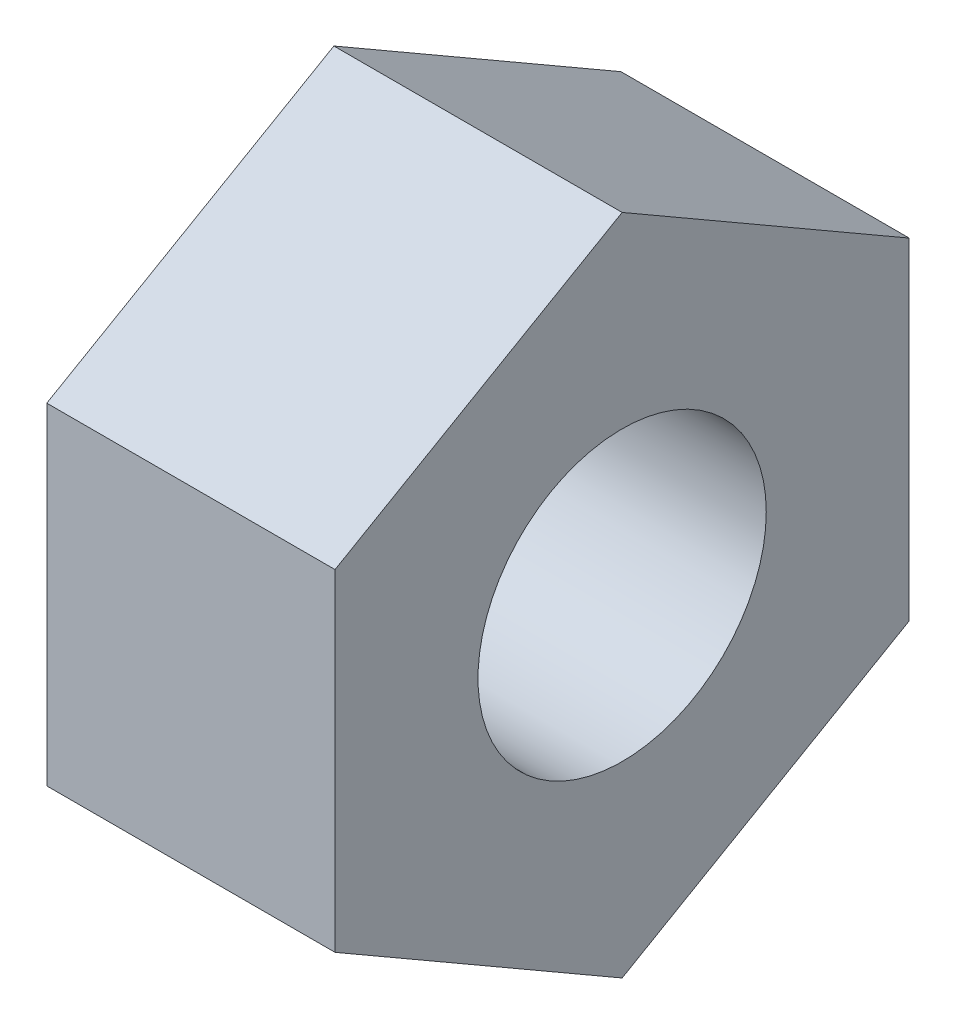
ISO-10303-21;
HEADER;
FILE_DESCRIPTION(('STEP AP214'),'2;1');
FILE_NAME('part.step','',(''),(''),'','','');
FILE_SCHEMA(('AUTOMOTIVE_DESIGN { 1 0 10303 214 1 1 1 1 }'));
ENDSEC;
DATA;
#1=APPLICATION_CONTEXT('core data for automotive mechanical design processes');
#2=APPLICATION_PROTOCOL_DEFINITION('international standard','automotive_design',2000,#1);
#3=PRODUCT_CONTEXT('',#1,'mechanical');
#4=PRODUCT('Part','Part','',(#3));
#5=PRODUCT_RELATED_PRODUCT_CATEGORY('part','',(#4));
#6=PRODUCT_DEFINITION_FORMATION('','',#4);
#7=PRODUCT_DEFINITION_CONTEXT('part definition',#1,'design');
#8=PRODUCT_DEFINITION('design','',#6,#7);
#9=PRODUCT_DEFINITION_SHAPE('','',#8);
#10=(LENGTH_UNIT() NAMED_UNIT(*) SI_UNIT(.MILLI.,.METRE.));
#11=(NAMED_UNIT(*) PLANE_ANGLE_UNIT() SI_UNIT($,.RADIAN.));
#12=(NAMED_UNIT(*) SI_UNIT($,.STERADIAN.) SOLID_ANGLE_UNIT());
#13=UNCERTAINTY_MEASURE_WITH_UNIT(LENGTH_MEASURE(1.E-05),#10,'distance_accuracy_value','');
#14=(GEOMETRIC_REPRESENTATION_CONTEXT(3) GLOBAL_UNCERTAINTY_ASSIGNED_CONTEXT((#13)) GLOBAL_UNIT_ASSIGNED_CONTEXT((#10,
#11,#12)) REPRESENTATION_CONTEXT('',''));
#15=CARTESIAN_POINT('',(0.,0.,0.));
#16=DIRECTION('',(0.,0.,1.));
#17=DIRECTION('',(1.,0.,0.));
#18=AXIS2_PLACEMENT_3D('',#15,#16,#17);
#19=CARTESIAN_POINT('',(10.,0.,0.));
#20=DIRECTION('',(1.,0.,0.));
#21=DIRECTION('',(0.,0.,-1.));
#22=AXIS2_PLACEMENT_3D('',#19,#20,#21);
#23=PLANE('',#22);
#24=DIRECTION('',(0.,0.499999999999995,0.866025403784442));
#25=VECTOR('',#24,1.);
#26=CARTESIAN_POINT('',(10.,5.7500000000001,-9.95929214352096));
#27=LINE('',#26,#25);
#28=CARTESIAN_POINT('',(10.,5.7500000000001,-9.95929214352096));
#29=VERTEX_POINT('',#28);
#30=CARTESIAN_POINT('',(10.,11.5,0.));
#31=VERTEX_POINT('',#30);
#32=EDGE_CURVE('E152',#29,#31,#27,.T.);
#33=ORIENTED_EDGE('',*,*,#32,.T.);
#34=DIRECTION('',(0.,-0.500000000000001,0.866025403784438));
#35=VECTOR('',#34,1.);
#36=CARTESIAN_POINT('',(10.,11.5,0.));
#37=LINE('',#36,#35);
#38=CARTESIAN_POINT('',(10.,5.74999999999997,9.95929214352104));
#39=VERTEX_POINT('',#38);
#40=EDGE_CURVE('E100',#31,#39,#37,.T.);
#41=ORIENTED_EDGE('',*,*,#40,.T.);
#42=DIRECTION('',(0.,-1.,0.));
#43=VECTOR('',#42,1.);
#44=CARTESIAN_POINT('',(10.,5.74999999999997,9.95929214352104));
#45=LINE('',#44,#43);
#46=CARTESIAN_POINT('',(10.,-5.75000000000003,9.959292143521));
#47=VERTEX_POINT('',#46);
#48=EDGE_CURVE('E113',#39,#47,#45,.T.);
#49=ORIENTED_EDGE('',*,*,#48,.T.);
#50=DIRECTION('',(0.,-0.499999999999995,-0.866025403784441));
#51=VECTOR('',#50,1.);
#52=CARTESIAN_POINT('',(10.,-5.75000000000003,9.959292143521));
#53=LINE('',#52,#51);
#54=CARTESIAN_POINT('',(10.,-11.5,0.));
#55=VERTEX_POINT('',#54);
#56=EDGE_CURVE('E107',#47,#55,#53,.T.);
#57=ORIENTED_EDGE('',*,*,#56,.T.);
#58=DIRECTION('',(0.,0.500000000000007,-0.866025403784435));
#59=VECTOR('',#58,1.);
#60=CARTESIAN_POINT('',(10.,-11.5,0.));
#61=LINE('',#60,#59);
#62=CARTESIAN_POINT('',(10.,-5.7499999999999,-9.95929214352108));
#63=VERTEX_POINT('',#62);
#64=EDGE_CURVE('E111',#55,#63,#61,.T.);
#65=ORIENTED_EDGE('',*,*,#64,.T.);
#66=DIRECTION('',(0.,1.,0.));
#67=VECTOR('',#66,1.);
#68=CARTESIAN_POINT('',(10.,-5.7499999999999,-9.95929214352108));
#69=LINE('',#68,#67);
#70=EDGE_CURVE('E63',#63,#29,#69,.T.);
#71=ORIENTED_EDGE('',*,*,#70,.T.);
#72=EDGE_LOOP('',(#33,#41,#49,#57,#65,#71));
#73=FACE_BOUND('',#72,.T.);
#74=CARTESIAN_POINT('',(10.,0.,0.));
#75=DIRECTION('',(1.,0.,0.));
#76=DIRECTION('',(0.,0.,-1.));
#77=AXIS2_PLACEMENT_3D('',#74,#75,#76);
#78=CIRCLE('',#77,5.);
#79=CARTESIAN_POINT('',(10.,0.,-5.));
#80=VERTEX_POINT('',#79);
#81=EDGE_CURVE('E140',#80,#80,#78,.T.);
#82=ORIENTED_EDGE('',*,*,#81,.F.);
#83=EDGE_LOOP('',(#82));
#84=FACE_BOUND('',#83,.T.);
#85=ADVANCED_FACE('F45',(#73,#84),#23,.T.);
#86=CARTESIAN_POINT('',(0.,0.,0.));
#87=DIRECTION('',(1.,0.,0.));
#88=DIRECTION('',(0.,0.,-1.));
#89=AXIS2_PLACEMENT_3D('',#86,#87,#88);
#90=PLANE('',#89);
#91=DIRECTION('',(0.,0.499999999999995,0.866025403784442));
#92=VECTOR('',#91,1.);
#93=CARTESIAN_POINT('',(0.,5.7500000000001,-9.95929214352096));
#94=LINE('',#93,#92);
#95=CARTESIAN_POINT('',(0.,5.7500000000001,-9.95929214352096));
#96=VERTEX_POINT('',#95);
#97=CARTESIAN_POINT('',(0.,11.5,0.));
#98=VERTEX_POINT('',#97);
#99=EDGE_CURVE('E135',#96,#98,#94,.T.);
#100=ORIENTED_EDGE('',*,*,#99,.F.);
#101=DIRECTION('',(0.,1.,0.));
#102=VECTOR('',#101,1.);
#103=CARTESIAN_POINT('',(0.,-5.7499999999999,-9.95929214352108));
#104=LINE('',#103,#102);
#105=CARTESIAN_POINT('',(0.,-5.7499999999999,-9.95929214352108));
#106=VERTEX_POINT('',#105);
#107=EDGE_CURVE('E92',#106,#96,#104,.T.);
#108=ORIENTED_EDGE('',*,*,#107,.F.);
#109=DIRECTION('',(0.,0.500000000000007,-0.866025403784435));
#110=VECTOR('',#109,1.);
#111=CARTESIAN_POINT('',(0.,-11.5,0.));
#112=LINE('',#111,#110);
#113=CARTESIAN_POINT('',(0.,-11.5,0.));
#114=VERTEX_POINT('',#113);
#115=EDGE_CURVE('E86',#114,#106,#112,.T.);
#116=ORIENTED_EDGE('',*,*,#115,.F.);
#117=DIRECTION('',(0.,-0.499999999999995,-0.866025403784441));
#118=VECTOR('',#117,1.);
#119=CARTESIAN_POINT('',(0.,-5.75000000000003,9.959292143521));
#120=LINE('',#119,#118);
#121=CARTESIAN_POINT('',(0.,-5.75000000000003,9.959292143521));
#122=VERTEX_POINT('',#121);
#123=EDGE_CURVE('E122',#122,#114,#120,.T.);
#124=ORIENTED_EDGE('',*,*,#123,.F.);
#125=DIRECTION('',(0.,-1.,0.));
#126=VECTOR('',#125,1.);
#127=CARTESIAN_POINT('',(0.,5.74999999999997,9.95929214352104));
#128=LINE('',#127,#126);
#129=CARTESIAN_POINT('',(0.,5.74999999999997,9.95929214352104));
#130=VERTEX_POINT('',#129);
#131=EDGE_CURVE('E143',#130,#122,#128,.T.);
#132=ORIENTED_EDGE('',*,*,#131,.F.);
#133=DIRECTION('',(0.,-0.500000000000001,0.866025403784438));
#134=VECTOR('',#133,1.);
#135=CARTESIAN_POINT('',(0.,11.5,0.));
#136=LINE('',#135,#134);
#137=EDGE_CURVE('E139',#98,#130,#136,.T.);
#138=ORIENTED_EDGE('',*,*,#137,.F.);
#139=EDGE_LOOP('',(#100,#108,#116,#124,#132,#138));
#140=FACE_BOUND('',#139,.T.);
#141=CARTESIAN_POINT('',(0.,0.,0.));
#142=DIRECTION('',(1.,0.,0.));
#143=DIRECTION('',(0.,0.,-1.));
#144=AXIS2_PLACEMENT_3D('',#141,#142,#143);
#145=CIRCLE('',#144,5.);
#146=CARTESIAN_POINT('',(0.,0.,-5.));
#147=VERTEX_POINT('',#146);
#148=EDGE_CURVE('E249',#147,#147,#145,.T.);
#149=ORIENTED_EDGE('',*,*,#148,.T.);
#150=EDGE_LOOP('',(#149));
#151=FACE_BOUND('',#150,.T.);
#152=ADVANCED_FACE('F165',(#140,#151),#90,.F.);
#153=CARTESIAN_POINT('',(10.,5.7500000000001,-9.95929214352096));
#154=DIRECTION('',(0.,-0.866025403784442,0.499999999999995));
#155=DIRECTION('',(0.,-0.499999999999995,-0.866025403784442));
#156=AXIS2_PLACEMENT_3D('',#153,#154,#155);
#157=PLANE('',#156);
#158=ORIENTED_EDGE('',*,*,#99,.T.);
#159=DIRECTION('',(-1.,0.,0.));
#160=VECTOR('',#159,1.);
#161=CARTESIAN_POINT('',(10.,11.5,0.));
#162=LINE('',#161,#160);
#163=EDGE_CURVE('E11',#31,#98,#162,.T.);
#164=ORIENTED_EDGE('',*,*,#163,.F.);
#165=ORIENTED_EDGE('',*,*,#32,.F.);
#166=DIRECTION('',(-1.,0.,0.));
#167=VECTOR('',#166,1.);
#168=CARTESIAN_POINT('',(10.,5.7500000000001,-9.95929214352096));
#169=LINE('',#168,#167);
#170=EDGE_CURVE('E131',#29,#96,#169,.T.);
#171=ORIENTED_EDGE('',*,*,#170,.T.);
#172=EDGE_LOOP('',(#158,#164,#165,#171));
#173=FACE_BOUND('',#172,.T.);
#174=ADVANCED_FACE('F47',(#173),#157,.F.);
#175=CARTESIAN_POINT('',(10.,11.5,0.));
#176=DIRECTION('',(0.,-0.866025403784438,-0.500000000000001));
#177=DIRECTION('',(0.,0.500000000000001,-0.866025403784438));
#178=AXIS2_PLACEMENT_3D('',#175,#176,#177);
#179=PLANE('',#178);
#180=ORIENTED_EDGE('',*,*,#137,.T.);
#181=DIRECTION('',(-1.,0.,0.));
#182=VECTOR('',#181,1.);
#183=CARTESIAN_POINT('',(10.,5.74999999999997,9.95929214352104));
#184=LINE('',#183,#182);
#185=EDGE_CURVE('E55',#39,#130,#184,.T.);
#186=ORIENTED_EDGE('',*,*,#185,.F.);
#187=ORIENTED_EDGE('',*,*,#40,.F.);
#188=ORIENTED_EDGE('',*,*,#163,.T.);
#189=EDGE_LOOP('',(#180,#186,#187,#188));
#190=FACE_BOUND('',#189,.T.);
#191=ADVANCED_FACE('F190',(#190),#179,.F.);
#192=CARTESIAN_POINT('',(10.,5.74999999999997,9.95929214352104));
#193=DIRECTION('',(0.,0.,-1.));
#194=DIRECTION('',(0.,1.,0.));
#195=AXIS2_PLACEMENT_3D('',#192,#193,#194);
#196=PLANE('',#195);
#197=ORIENTED_EDGE('',*,*,#131,.T.);
#198=DIRECTION('',(-1.,0.,0.));
#199=VECTOR('',#198,1.);
#200=CARTESIAN_POINT('',(10.,-5.75000000000003,9.959292143521));
#201=LINE('',#200,#199);
#202=EDGE_CURVE('E124',#47,#122,#201,.T.);
#203=ORIENTED_EDGE('',*,*,#202,.F.);
#204=ORIENTED_EDGE('',*,*,#48,.F.);
#205=ORIENTED_EDGE('',*,*,#185,.T.);
#206=EDGE_LOOP('',(#197,#203,#204,#205));
#207=FACE_BOUND('',#206,.T.);
#208=ADVANCED_FACE('F162',(#207),#196,.F.);
#209=CARTESIAN_POINT('',(10.,-5.75000000000003,9.959292143521));
#210=DIRECTION('',(0.,0.866025403784442,-0.499999999999995));
#211=DIRECTION('',(0.,0.499999999999995,0.866025403784442));
#212=AXIS2_PLACEMENT_3D('',#209,#210,#211);
#213=PLANE('',#212);
#214=ORIENTED_EDGE('',*,*,#123,.T.);
#215=DIRECTION('',(-1.,0.,0.));
#216=VECTOR('',#215,1.);
#217=CARTESIAN_POINT('',(10.,-11.5,0.));
#218=LINE('',#217,#216);
#219=EDGE_CURVE('E119',#55,#114,#218,.T.);
#220=ORIENTED_EDGE('',*,*,#219,.F.);
#221=ORIENTED_EDGE('',*,*,#56,.F.);
#222=ORIENTED_EDGE('',*,*,#202,.T.);
#223=EDGE_LOOP('',(#214,#220,#221,#222));
#224=FACE_BOUND('',#223,.T.);
#225=ADVANCED_FACE('F120',(#224),#213,.F.);
#226=CARTESIAN_POINT('',(10.,-11.5,0.));
#227=DIRECTION('',(0.,0.866025403784435,0.500000000000007));
#228=DIRECTION('',(0.,-0.500000000000007,0.866025403784435));
#229=AXIS2_PLACEMENT_3D('',#226,#227,#228);
#230=PLANE('',#229);
#231=ORIENTED_EDGE('',*,*,#115,.T.);
#232=DIRECTION('',(-1.,0.,0.));
#233=VECTOR('',#232,1.);
#234=CARTESIAN_POINT('',(10.,-5.7499999999999,-9.95929214352108));
#235=LINE('',#234,#233);
#236=EDGE_CURVE('E125',#63,#106,#235,.T.);
#237=ORIENTED_EDGE('',*,*,#236,.F.);
#238=ORIENTED_EDGE('',*,*,#64,.F.);
#239=ORIENTED_EDGE('',*,*,#219,.T.);
#240=EDGE_LOOP('',(#231,#237,#238,#239));
#241=FACE_BOUND('',#240,.T.);
#242=ADVANCED_FACE('F127',(#241),#230,.F.);
#243=CARTESIAN_POINT('',(10.,-5.7499999999999,-9.95929214352108));
#244=DIRECTION('',(0.,0.,1.));
#245=DIRECTION('',(0.,-1.,0.));
#246=AXIS2_PLACEMENT_3D('',#243,#244,#245);
#247=PLANE('',#246);
#248=ORIENTED_EDGE('',*,*,#107,.T.);
#249=ORIENTED_EDGE('',*,*,#170,.F.);
#250=ORIENTED_EDGE('',*,*,#70,.F.);
#251=ORIENTED_EDGE('',*,*,#236,.T.);
#252=EDGE_LOOP('',(#248,#249,#250,#251));
#253=FACE_BOUND('',#252,.T.);
#254=ADVANCED_FACE('F170',(#253),#247,.F.);
#255=CARTESIAN_POINT('',(10.,0.,0.));
#256=DIRECTION('',(-1.,0.,0.));
#257=DIRECTION('',(0.,0.,1.));
#258=AXIS2_PLACEMENT_3D('',#255,#256,#257);
#259=CYLINDRICAL_SURFACE('',#258,5.);
#260=ORIENTED_EDGE('',*,*,#81,.T.);
#261=EDGE_LOOP('',(#260));
#262=FACE_BOUND('',#261,.T.);
#263=ORIENTED_EDGE('',*,*,#148,.F.);
#264=EDGE_LOOP('',(#263));
#265=FACE_BOUND('',#264,.T.);
#266=ADVANCED_FACE('F172',(#262,#265),#259,.F.);
#267=CLOSED_SHELL('',(#85,#152,#174,#191,#208,#225,#242,#254,#266));
#268=MANIFOLD_SOLID_BREP('B2',#267);
#269=ADVANCED_BREP_SHAPE_REPRESENTATION('',(#18,#268),#14);
#270=SHAPE_DEFINITION_REPRESENTATION(#9,#269);
ENDSEC;
END-ISO-10303-21;
